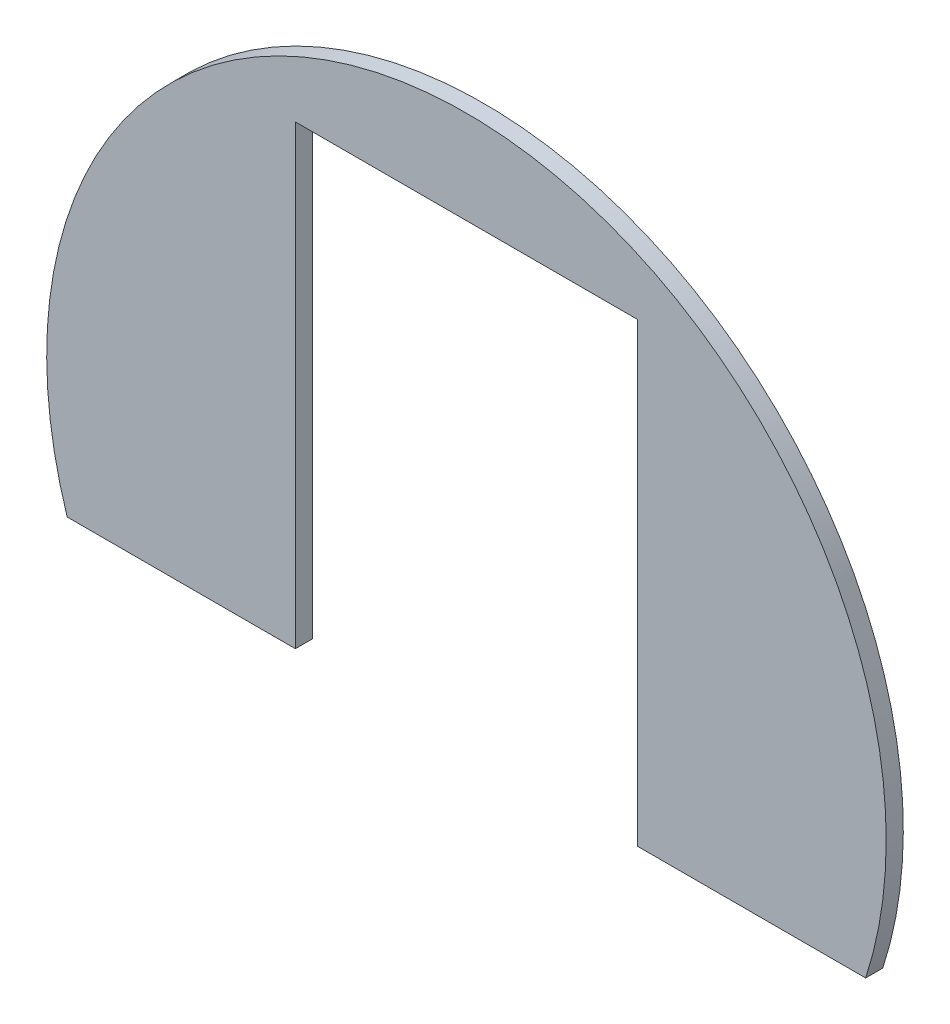
ISO-10303-21;
HEADER;
FILE_DESCRIPTION(('STEP AP214'),'2;1');
FILE_NAME('part.step','',(''),(''),'','','');
FILE_SCHEMA(('AUTOMOTIVE_DESIGN { 1 0 10303 214 1 1 1 1 }'));
ENDSEC;
DATA;
#1=APPLICATION_CONTEXT('core data for automotive mechanical design processes');
#2=APPLICATION_PROTOCOL_DEFINITION('international standard','automotive_design',2000,#1);
#3=PRODUCT_CONTEXT('',#1,'mechanical');
#4=PRODUCT('Part','Part','',(#3));
#5=PRODUCT_RELATED_PRODUCT_CATEGORY('part','',(#4));
#6=PRODUCT_DEFINITION_FORMATION('','',#4);
#7=PRODUCT_DEFINITION_CONTEXT('part definition',#1,'design');
#8=PRODUCT_DEFINITION('design','',#6,#7);
#9=PRODUCT_DEFINITION_SHAPE('','',#8);
#10=(LENGTH_UNIT() NAMED_UNIT(*) SI_UNIT(.MILLI.,.METRE.));
#11=(NAMED_UNIT(*) PLANE_ANGLE_UNIT() SI_UNIT($,.RADIAN.));
#12=(NAMED_UNIT(*) SI_UNIT($,.STERADIAN.) SOLID_ANGLE_UNIT());
#13=UNCERTAINTY_MEASURE_WITH_UNIT(LENGTH_MEASURE(1.E-05),#10,'distance_accuracy_value','');
#14=(GEOMETRIC_REPRESENTATION_CONTEXT(3) GLOBAL_UNCERTAINTY_ASSIGNED_CONTEXT((#13)) GLOBAL_UNIT_ASSIGNED_CONTEXT((#10,
#11,#12)) REPRESENTATION_CONTEXT('',''));
#15=CARTESIAN_POINT('',(0.,0.,0.));
#16=DIRECTION('',(0.,0.,1.));
#17=DIRECTION('',(1.,0.,0.));
#18=AXIS2_PLACEMENT_3D('',#15,#16,#17);
#19=CARTESIAN_POINT('',(0.,0.,76.2));
#20=DIRECTION('',(0.,0.,-1.));
#21=DIRECTION('',(-1.,0.,0.));
#22=AXIS2_PLACEMENT_3D('',#19,#20,#21);
#23=CYLINDRICAL_SURFACE('',#22,1869.44);
#24=CARTESIAN_POINT('',(0.,0.,0.));
#25=DIRECTION('',(0.,0.,1.));
#26=DIRECTION('',(1.,0.,0.));
#27=AXIS2_PLACEMENT_3D('',#24,#25,#26);
#28=CIRCLE('',#27,1869.44);
#29=CARTESIAN_POINT('',(1778.,-577.51356139921,0.));
#30=VERTEX_POINT('',#29);
#31=CARTESIAN_POINT('',(-1778.,-577.51356139921,0.));
#32=VERTEX_POINT('',#31);
#33=EDGE_CURVE('E118',#30,#32,#28,.T.);
#34=ORIENTED_EDGE('',*,*,#33,.T.);
#35=DIRECTION('',(0.,0.,-1.));
#36=VECTOR('',#35,1.);
#37=CARTESIAN_POINT('',(-1778.,-577.51356139921,76.2));
#38=LINE('',#37,#36);
#39=CARTESIAN_POINT('',(-1778.,-577.51356139921,76.2));
#40=VERTEX_POINT('',#39);
#41=EDGE_CURVE('E11',#40,#32,#38,.T.);
#42=ORIENTED_EDGE('',*,*,#41,.F.);
#43=CARTESIAN_POINT('',(0.,0.,76.2));
#44=DIRECTION('',(0.,0.,1.));
#45=DIRECTION('',(1.,0.,0.));
#46=AXIS2_PLACEMENT_3D('',#43,#44,#45);
#47=CIRCLE('',#46,1869.44);
#48=CARTESIAN_POINT('',(1778.,-577.51356139921,76.2));
#49=VERTEX_POINT('',#48);
#50=EDGE_CURVE('E129',#49,#40,#47,.T.);
#51=ORIENTED_EDGE('',*,*,#50,.F.);
#52=DIRECTION('',(0.,0.,-1.));
#53=VECTOR('',#52,1.);
#54=CARTESIAN_POINT('',(1778.,-577.51356139921,76.2));
#55=LINE('',#54,#53);
#56=EDGE_CURVE('E114',#49,#30,#55,.T.);
#57=ORIENTED_EDGE('',*,*,#56,.T.);
#58=EDGE_LOOP('',(#34,#42,#51,#57));
#59=FACE_BOUND('',#58,.T.);
#60=ADVANCED_FACE('F35',(#59),#23,.T.);
#61=CARTESIAN_POINT('',(0.,-577.51356139921,76.2));
#62=DIRECTION('',(0.,1.,0.));
#63=DIRECTION('',(0.,0.,1.));
#64=AXIS2_PLACEMENT_3D('',#61,#62,#63);
#65=PLANE('',#64);
#66=DIRECTION('',(1.,0.,0.));
#67=VECTOR('',#66,1.);
#68=CARTESIAN_POINT('',(0.,-577.51356139921,0.));
#69=LINE('',#68,#67);
#70=CARTESIAN_POINT('',(-762.,-577.51356139921,0.));
#71=VERTEX_POINT('',#70);
#72=EDGE_CURVE('E121',#32,#71,#69,.T.);
#73=ORIENTED_EDGE('',*,*,#72,.T.);
#74=DIRECTION('',(0.,0.,-1.));
#75=VECTOR('',#74,1.);
#76=CARTESIAN_POINT('',(-762.,-577.51356139921,76.2));
#77=LINE('',#76,#75);
#78=CARTESIAN_POINT('',(-762.,-577.51356139921,76.2));
#79=VERTEX_POINT('',#78);
#80=EDGE_CURVE('E43',#79,#71,#77,.T.);
#81=ORIENTED_EDGE('',*,*,#80,.F.);
#82=DIRECTION('',(1.,0.,0.));
#83=VECTOR('',#82,1.);
#84=CARTESIAN_POINT('',(0.,-577.51356139921,76.2));
#85=LINE('',#84,#83);
#86=EDGE_CURVE('E84',#40,#79,#85,.T.);
#87=ORIENTED_EDGE('',*,*,#86,.F.);
#88=ORIENTED_EDGE('',*,*,#41,.T.);
#89=EDGE_LOOP('',(#73,#81,#87,#88));
#90=FACE_BOUND('',#89,.T.);
#91=ADVANCED_FACE('F153',(#90),#65,.F.);
#92=CARTESIAN_POINT('',(-762.,0.,76.2));
#93=DIRECTION('',(-1.,0.,0.));
#94=DIRECTION('',(0.,0.,1.));
#95=AXIS2_PLACEMENT_3D('',#92,#93,#94);
#96=PLANE('',#95);
#97=DIRECTION('',(0.,1.,0.));
#98=VECTOR('',#97,1.);
#99=CARTESIAN_POINT('',(-762.,0.,0.));
#100=LINE('',#99,#98);
#101=CARTESIAN_POINT('',(-762.,1454.48643860079,0.));
#102=VERTEX_POINT('',#101);
#103=EDGE_CURVE('E123',#71,#102,#100,.T.);
#104=ORIENTED_EDGE('',*,*,#103,.T.);
#105=DIRECTION('',(0.,0.,-1.));
#106=VECTOR('',#105,1.);
#107=CARTESIAN_POINT('',(-762.,1454.48643860079,76.2));
#108=LINE('',#107,#106);
#109=CARTESIAN_POINT('',(-762.,1454.48643860079,76.2));
#110=VERTEX_POINT('',#109);
#111=EDGE_CURVE('E110',#110,#102,#108,.T.);
#112=ORIENTED_EDGE('',*,*,#111,.F.);
#113=DIRECTION('',(0.,1.,0.));
#114=VECTOR('',#113,1.);
#115=CARTESIAN_POINT('',(-762.,0.,76.2));
#116=LINE('',#115,#114);
#117=EDGE_CURVE('E97',#79,#110,#116,.T.);
#118=ORIENTED_EDGE('',*,*,#117,.F.);
#119=ORIENTED_EDGE('',*,*,#80,.T.);
#120=EDGE_LOOP('',(#104,#112,#118,#119));
#121=FACE_BOUND('',#120,.T.);
#122=ADVANCED_FACE('F135',(#121),#96,.F.);
#123=CARTESIAN_POINT('',(-2.11916579152184E-13,1454.48643860079,76.2));
#124=DIRECTION('',(0.,1.,0.));
#125=DIRECTION('',(-1.,0.,0.));
#126=AXIS2_PLACEMENT_3D('',#123,#124,#125);
#127=PLANE('',#126);
#128=DIRECTION('',(1.,0.,0.));
#129=VECTOR('',#128,1.);
#130=CARTESIAN_POINT('',(-2.11916579152184E-13,1454.48643860079,0.));
#131=LINE('',#130,#129);
#132=CARTESIAN_POINT('',(762.,1454.48643860079,0.));
#133=VERTEX_POINT('',#132);
#134=EDGE_CURVE('E106',#102,#133,#131,.T.);
#135=ORIENTED_EDGE('',*,*,#134,.T.);
#136=DIRECTION('',(0.,0.,-1.));
#137=VECTOR('',#136,1.);
#138=CARTESIAN_POINT('',(762.,1454.48643860079,76.2));
#139=LINE('',#138,#137);
#140=CARTESIAN_POINT('',(762.,1454.48643860079,76.2));
#141=VERTEX_POINT('',#140);
#142=EDGE_CURVE('E103',#141,#133,#139,.T.);
#143=ORIENTED_EDGE('',*,*,#142,.F.);
#144=DIRECTION('',(1.,0.,0.));
#145=VECTOR('',#144,1.);
#146=CARTESIAN_POINT('',(-2.11916579152184E-13,1454.48643860079,76.2));
#147=LINE('',#146,#145);
#148=EDGE_CURVE('E91',#110,#141,#147,.T.);
#149=ORIENTED_EDGE('',*,*,#148,.F.);
#150=ORIENTED_EDGE('',*,*,#111,.T.);
#151=EDGE_LOOP('',(#135,#143,#149,#150));
#152=FACE_BOUND('',#151,.T.);
#153=ADVANCED_FACE('F104',(#152),#127,.F.);
#154=CARTESIAN_POINT('',(762.,2.4980018054066E-13,76.2));
#155=DIRECTION('',(-1.,0.,0.));
#156=DIRECTION('',(0.,-1.,0.));
#157=AXIS2_PLACEMENT_3D('',#154,#155,#156);
#158=PLANE('',#157);
#159=DIRECTION('',(0.,1.,0.));
#160=VECTOR('',#159,1.);
#161=CARTESIAN_POINT('',(762.,2.4980018054066E-13,0.));
#162=LINE('',#161,#160);
#163=CARTESIAN_POINT('',(762.000000000001,-577.51356139921,0.));
#164=VERTEX_POINT('',#163);
#165=EDGE_CURVE('E126',#164,#133,#162,.T.);
#166=ORIENTED_EDGE('',*,*,#165,.F.);
#167=DIRECTION('',(0.,0.,-1.));
#168=VECTOR('',#167,1.);
#169=CARTESIAN_POINT('',(762.000000000001,-577.51356139921,76.2));
#170=LINE('',#169,#168);
#171=CARTESIAN_POINT('',(762.000000000001,-577.51356139921,76.2));
#172=VERTEX_POINT('',#171);
#173=EDGE_CURVE('E73',#172,#164,#170,.T.);
#174=ORIENTED_EDGE('',*,*,#173,.F.);
#175=DIRECTION('',(0.,1.,0.));
#176=VECTOR('',#175,1.);
#177=CARTESIAN_POINT('',(762.,2.4980018054066E-13,76.2));
#178=LINE('',#177,#176);
#179=EDGE_CURVE('E95',#172,#141,#178,.T.);
#180=ORIENTED_EDGE('',*,*,#179,.T.);
#181=ORIENTED_EDGE('',*,*,#142,.T.);
#182=EDGE_LOOP('',(#166,#174,#180,#181));
#183=FACE_BOUND('',#182,.T.);
#184=ADVANCED_FACE('F112',(#183),#158,.T.);
#185=CARTESIAN_POINT('',(0.,-577.51356139921,76.2));
#186=DIRECTION('',(0.,1.,0.));
#187=DIRECTION('',(0.,0.,1.));
#188=AXIS2_PLACEMENT_3D('',#185,#186,#187);
#189=PLANE('',#188);
#190=DIRECTION('',(1.,0.,0.));
#191=VECTOR('',#190,1.);
#192=CARTESIAN_POINT('',(0.,-577.51356139921,0.));
#193=LINE('',#192,#191);
#194=EDGE_CURVE('E76',#164,#30,#193,.T.);
#195=ORIENTED_EDGE('',*,*,#194,.T.);
#196=ORIENTED_EDGE('',*,*,#56,.F.);
#197=DIRECTION('',(1.,0.,0.));
#198=VECTOR('',#197,1.);
#199=CARTESIAN_POINT('',(0.,-577.51356139921,76.2));
#200=LINE('',#199,#198);
#201=EDGE_CURVE('E51',#172,#49,#200,.T.);
#202=ORIENTED_EDGE('',*,*,#201,.F.);
#203=ORIENTED_EDGE('',*,*,#173,.T.);
#204=EDGE_LOOP('',(#195,#196,#202,#203));
#205=FACE_BOUND('',#204,.T.);
#206=ADVANCED_FACE('F142',(#205),#189,.F.);
#207=CARTESIAN_POINT('',(0.,0.,76.2));
#208=DIRECTION('',(0.,0.,1.));
#209=DIRECTION('',(1.,0.,0.));
#210=AXIS2_PLACEMENT_3D('',#207,#208,#209);
#211=PLANE('',#210);
#212=ORIENTED_EDGE('',*,*,#50,.T.);
#213=ORIENTED_EDGE('',*,*,#86,.T.);
#214=ORIENTED_EDGE('',*,*,#117,.T.);
#215=ORIENTED_EDGE('',*,*,#148,.T.);
#216=ORIENTED_EDGE('',*,*,#179,.F.);
#217=ORIENTED_EDGE('',*,*,#201,.T.);
#218=EDGE_LOOP('',(#212,#213,#214,#215,#216,#217));
#219=FACE_BOUND('',#218,.T.);
#220=ADVANCED_FACE('F93',(#219),#211,.T.);
#221=CARTESIAN_POINT('',(0.,0.,0.));
#222=DIRECTION('',(0.,0.,1.));
#223=DIRECTION('',(1.,0.,0.));
#224=AXIS2_PLACEMENT_3D('',#221,#222,#223);
#225=PLANE('',#224);
#226=ORIENTED_EDGE('',*,*,#33,.F.);
#227=ORIENTED_EDGE('',*,*,#194,.F.);
#228=ORIENTED_EDGE('',*,*,#165,.T.);
#229=ORIENTED_EDGE('',*,*,#134,.F.);
#230=ORIENTED_EDGE('',*,*,#103,.F.);
#231=ORIENTED_EDGE('',*,*,#72,.F.);
#232=EDGE_LOOP('',(#226,#227,#228,#229,#230,#231));
#233=FACE_BOUND('',#232,.T.);
#234=ADVANCED_FACE('F138',(#233),#225,.F.);
#235=CLOSED_SHELL('',(#60,#91,#122,#153,#184,#206,#220,#234));
#236=MANIFOLD_SOLID_BREP('B2',#235);
#237=ADVANCED_BREP_SHAPE_REPRESENTATION('',(#18,#236),#14);
#238=SHAPE_DEFINITION_REPRESENTATION(#9,#237);
ENDSEC;
END-ISO-10303-21;
